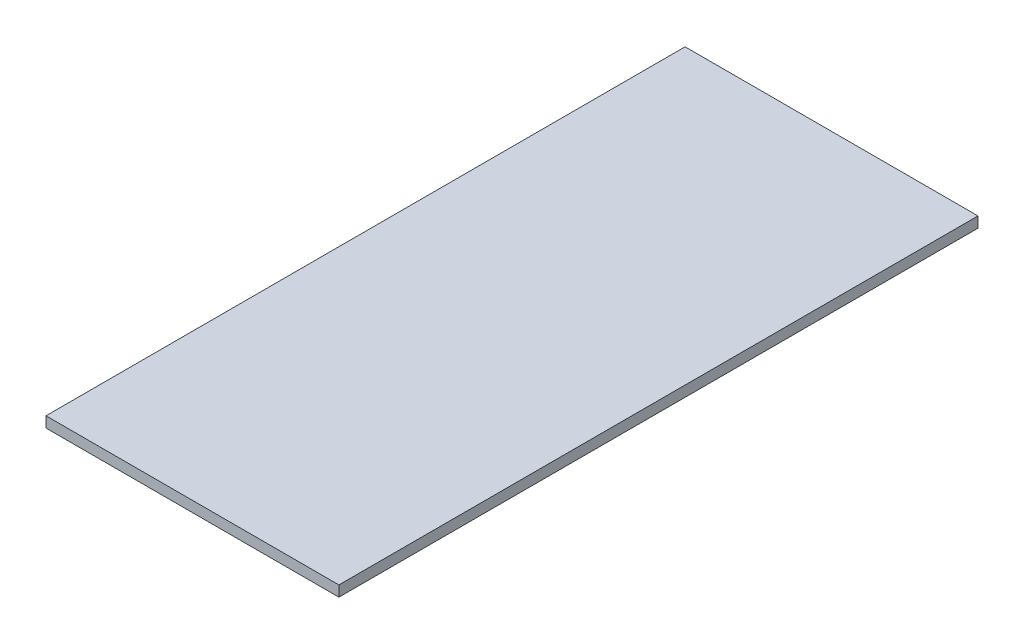
ISO-10303-21;
HEADER;
FILE_DESCRIPTION(('STEP AP214'),'2;1');
FILE_NAME('part.step','',(''),(''),'','','');
FILE_SCHEMA(('AUTOMOTIVE_DESIGN { 1 0 10303 214 1 1 1 1 }'));
ENDSEC;
DATA;
#1=APPLICATION_CONTEXT('core data for automotive mechanical design processes');
#2=APPLICATION_PROTOCOL_DEFINITION('international standard','automotive_design',2000,#1);
#3=PRODUCT_CONTEXT('',#1,'mechanical');
#4=PRODUCT('Part','Part','',(#3));
#5=PRODUCT_RELATED_PRODUCT_CATEGORY('part','',(#4));
#6=PRODUCT_DEFINITION_FORMATION('','',#4);
#7=PRODUCT_DEFINITION_CONTEXT('part definition',#1,'design');
#8=PRODUCT_DEFINITION('design','',#6,#7);
#9=PRODUCT_DEFINITION_SHAPE('','',#8);
#10=(LENGTH_UNIT() NAMED_UNIT(*) SI_UNIT(.MILLI.,.METRE.));
#11=(NAMED_UNIT(*) PLANE_ANGLE_UNIT() SI_UNIT($,.RADIAN.));
#12=(NAMED_UNIT(*) SI_UNIT($,.STERADIAN.) SOLID_ANGLE_UNIT());
#13=UNCERTAINTY_MEASURE_WITH_UNIT(LENGTH_MEASURE(1.E-05),#10,'distance_accuracy_value','');
#14=(GEOMETRIC_REPRESENTATION_CONTEXT(3) GLOBAL_UNCERTAINTY_ASSIGNED_CONTEXT((#13)) GLOBAL_UNIT_ASSIGNED_CONTEXT((#10,
#11,#12)) REPRESENTATION_CONTEXT('',''));
#15=CARTESIAN_POINT('',(0.,0.,0.));
#16=DIRECTION('',(0.,0.,1.));
#17=DIRECTION('',(1.,0.,0.));
#18=AXIS2_PLACEMENT_3D('',#15,#16,#17);
#19=CARTESIAN_POINT('',(-30.0000000000001,20.,-1147.65100671141));
#20=DIRECTION('',(1.,0.,0.));
#21=DIRECTION('',(0.,0.,-1.));
#22=AXIS2_PLACEMENT_3D('',#19,#20,#21);
#23=PLANE('',#22);
#24=DIRECTION('',(0.,0.,1.));
#25=VECTOR('',#24,1.);
#26=CARTESIAN_POINT('',(-30.0000000000001,0.,-1147.65100671141));
#27=LINE('',#26,#25);
#28=CARTESIAN_POINT('',(-30.0000000000001,0.,-1147.65100671141));
#29=VERTEX_POINT('',#28);
#30=CARTESIAN_POINT('',(-30.,0.,52.3489932885905));
#31=VERTEX_POINT('',#30);
#32=EDGE_CURVE('E109',#29,#31,#27,.T.);
#33=ORIENTED_EDGE('',*,*,#32,.T.);
#34=DIRECTION('',(0.,-1.,0.));
#35=VECTOR('',#34,1.);
#36=CARTESIAN_POINT('',(-30.,20.,52.3489932885905));
#37=LINE('',#36,#35);
#38=CARTESIAN_POINT('',(-30.,20.,52.3489932885905));
#39=VERTEX_POINT('',#38);
#40=EDGE_CURVE('E11',#39,#31,#37,.T.);
#41=ORIENTED_EDGE('',*,*,#40,.F.);
#42=DIRECTION('',(0.,0.,1.));
#43=VECTOR('',#42,1.);
#44=CARTESIAN_POINT('',(-30.0000000000001,20.,-1147.65100671141));
#45=LINE('',#44,#43);
#46=CARTESIAN_POINT('',(-30.0000000000001,20.,-1147.65100671141));
#47=VERTEX_POINT('',#46);
#48=EDGE_CURVE('E92',#47,#39,#45,.T.);
#49=ORIENTED_EDGE('',*,*,#48,.F.);
#50=DIRECTION('',(0.,-1.,0.));
#51=VECTOR('',#50,1.);
#52=CARTESIAN_POINT('',(-30.0000000000001,20.,-1147.65100671141));
#53=LINE('',#52,#51);
#54=EDGE_CURVE('E105',#47,#29,#53,.T.);
#55=ORIENTED_EDGE('',*,*,#54,.T.);
#56=EDGE_LOOP('',(#33,#41,#49,#55));
#57=FACE_BOUND('',#56,.T.);
#58=ADVANCED_FACE('F40',(#57),#23,.F.);
#59=CARTESIAN_POINT('',(-30.,20.,52.3489932885905));
#60=DIRECTION('',(0.,0.,-1.));
#61=DIRECTION('',(-1.,0.,0.));
#62=AXIS2_PLACEMENT_3D('',#59,#60,#61);
#63=PLANE('',#62);
#64=DIRECTION('',(1.,0.,0.));
#65=VECTOR('',#64,1.);
#66=CARTESIAN_POINT('',(-30.,0.,52.3489932885905));
#67=LINE('',#66,#65);
#68=CARTESIAN_POINT('',(520.,0.,52.3489932885905));
#69=VERTEX_POINT('',#68);
#70=EDGE_CURVE('E97',#31,#69,#67,.T.);
#71=ORIENTED_EDGE('',*,*,#70,.T.);
#72=DIRECTION('',(0.,-1.,0.));
#73=VECTOR('',#72,1.);
#74=CARTESIAN_POINT('',(520.,20.,52.3489932885905));
#75=LINE('',#74,#73);
#76=CARTESIAN_POINT('',(520.,20.,52.3489932885905));
#77=VERTEX_POINT('',#76);
#78=EDGE_CURVE('E49',#77,#69,#75,.T.);
#79=ORIENTED_EDGE('',*,*,#78,.F.);
#80=DIRECTION('',(1.,0.,0.));
#81=VECTOR('',#80,1.);
#82=CARTESIAN_POINT('',(-30.,20.,52.3489932885905));
#83=LINE('',#82,#81);
#84=EDGE_CURVE('E87',#39,#77,#83,.T.);
#85=ORIENTED_EDGE('',*,*,#84,.F.);
#86=ORIENTED_EDGE('',*,*,#40,.T.);
#87=EDGE_LOOP('',(#71,#79,#85,#86));
#88=FACE_BOUND('',#87,.T.);
#89=ADVANCED_FACE('F96',(#88),#63,.F.);
#90=CARTESIAN_POINT('',(520.,20.,-1147.65100671141));
#91=DIRECTION('',(-1.,0.,0.));
#92=DIRECTION('',(0.,0.,1.));
#93=AXIS2_PLACEMENT_3D('',#90,#91,#92);
#94=PLANE('',#93);
#95=DIRECTION('',(0.,0.,-1.));
#96=VECTOR('',#95,1.);
#97=CARTESIAN_POINT('',(520.,0.,-1147.65100671141));
#98=LINE('',#97,#96);
#99=CARTESIAN_POINT('',(520.,0.,-1147.65100671141));
#100=VERTEX_POINT('',#99);
#101=EDGE_CURVE('E74',#69,#100,#98,.T.);
#102=ORIENTED_EDGE('',*,*,#101,.T.);
#103=DIRECTION('',(0.,-1.,0.));
#104=VECTOR('',#103,1.);
#105=CARTESIAN_POINT('',(520.,20.,-1147.65100671141));
#106=LINE('',#105,#104);
#107=CARTESIAN_POINT('',(520.,20.,-1147.65100671141));
#108=VERTEX_POINT('',#107);
#109=EDGE_CURVE('E99',#108,#100,#106,.T.);
#110=ORIENTED_EDGE('',*,*,#109,.F.);
#111=DIRECTION('',(0.,0.,-1.));
#112=VECTOR('',#111,1.);
#113=CARTESIAN_POINT('',(520.,20.,-1147.65100671141));
#114=LINE('',#113,#112);
#115=EDGE_CURVE('E90',#77,#108,#114,.T.);
#116=ORIENTED_EDGE('',*,*,#115,.F.);
#117=ORIENTED_EDGE('',*,*,#78,.T.);
#118=EDGE_LOOP('',(#102,#110,#116,#117));
#119=FACE_BOUND('',#118,.T.);
#120=ADVANCED_FACE('F100',(#119),#94,.F.);
#121=CARTESIAN_POINT('',(-30.0000000000001,20.,-1147.65100671141));
#122=DIRECTION('',(0.,0.,1.));
#123=DIRECTION('',(1.,0.,0.));
#124=AXIS2_PLACEMENT_3D('',#121,#122,#123);
#125=PLANE('',#124);
#126=DIRECTION('',(-1.,0.,0.));
#127=VECTOR('',#126,1.);
#128=CARTESIAN_POINT('',(-30.0000000000001,0.,-1147.65100671141));
#129=LINE('',#128,#127);
#130=EDGE_CURVE('E80',#100,#29,#129,.T.);
#131=ORIENTED_EDGE('',*,*,#130,.T.);
#132=ORIENTED_EDGE('',*,*,#54,.F.);
#133=DIRECTION('',(-1.,0.,0.));
#134=VECTOR('',#133,1.);
#135=CARTESIAN_POINT('',(-30.0000000000001,20.,-1147.65100671141));
#136=LINE('',#135,#134);
#137=EDGE_CURVE('E57',#108,#47,#136,.T.);
#138=ORIENTED_EDGE('',*,*,#137,.F.);
#139=ORIENTED_EDGE('',*,*,#109,.T.);
#140=EDGE_LOOP('',(#131,#132,#138,#139));
#141=FACE_BOUND('',#140,.T.);
#142=ADVANCED_FACE('F123',(#141),#125,.F.);
#143=CARTESIAN_POINT('',(0.,20.,0.));
#144=DIRECTION('',(0.,1.,0.));
#145=DIRECTION('',(0.,0.,1.));
#146=AXIS2_PLACEMENT_3D('',#143,#144,#145);
#147=PLANE('',#146);
#148=ORIENTED_EDGE('',*,*,#48,.T.);
#149=ORIENTED_EDGE('',*,*,#84,.T.);
#150=ORIENTED_EDGE('',*,*,#115,.T.);
#151=ORIENTED_EDGE('',*,*,#137,.T.);
#152=EDGE_LOOP('',(#148,#149,#150,#151));
#153=FACE_BOUND('',#152,.T.);
#154=ADVANCED_FACE('F88',(#153),#147,.T.);
#155=CARTESIAN_POINT('',(0.,0.,0.));
#156=DIRECTION('',(0.,1.,0.));
#157=DIRECTION('',(0.,0.,1.));
#158=AXIS2_PLACEMENT_3D('',#155,#156,#157);
#159=PLANE('',#158);
#160=ORIENTED_EDGE('',*,*,#32,.F.);
#161=ORIENTED_EDGE('',*,*,#130,.F.);
#162=ORIENTED_EDGE('',*,*,#101,.F.);
#163=ORIENTED_EDGE('',*,*,#70,.F.);
#164=EDGE_LOOP('',(#160,#161,#162,#163));
#165=FACE_BOUND('',#164,.T.);
#166=ADVANCED_FACE('F126',(#165),#159,.F.);
#167=CLOSED_SHELL('',(#58,#89,#120,#142,#154,#166));
#168=MANIFOLD_SOLID_BREP('B2',#167);
#169=ADVANCED_BREP_SHAPE_REPRESENTATION('',(#18,#168),#14);
#170=SHAPE_DEFINITION_REPRESENTATION(#9,#169);
ENDSEC;
END-ISO-10303-21;
